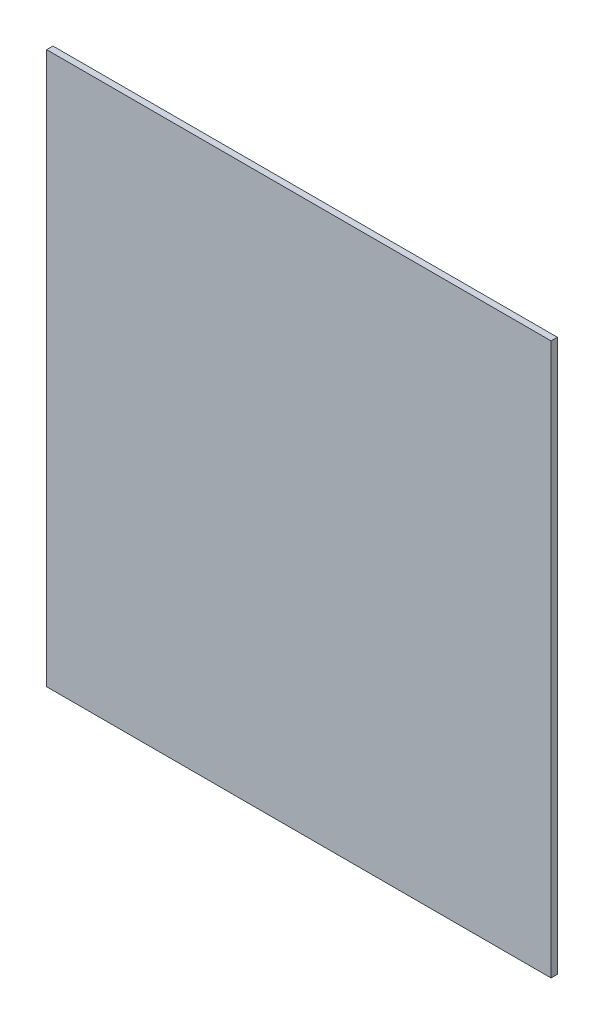
ISO-10303-21;
HEADER;
FILE_DESCRIPTION(('STEP AP214'),'2;1');
FILE_NAME('part.step','',(''),(''),'','','');
FILE_SCHEMA(('AUTOMOTIVE_DESIGN { 1 0 10303 214 1 1 1 1 }'));
ENDSEC;
DATA;
#1=APPLICATION_CONTEXT('core data for automotive mechanical design processes');
#2=APPLICATION_PROTOCOL_DEFINITION('international standard','automotive_design',2000,#1);
#3=PRODUCT_CONTEXT('',#1,'mechanical');
#4=PRODUCT('Part','Part','',(#3));
#5=PRODUCT_RELATED_PRODUCT_CATEGORY('part','',(#4));
#6=PRODUCT_DEFINITION_FORMATION('','',#4);
#7=PRODUCT_DEFINITION_CONTEXT('part definition',#1,'design');
#8=PRODUCT_DEFINITION('design','',#6,#7);
#9=PRODUCT_DEFINITION_SHAPE('','',#8);
#10=(LENGTH_UNIT() NAMED_UNIT(*) SI_UNIT(.MILLI.,.METRE.));
#11=(NAMED_UNIT(*) PLANE_ANGLE_UNIT() SI_UNIT($,.RADIAN.));
#12=(NAMED_UNIT(*) SI_UNIT($,.STERADIAN.) SOLID_ANGLE_UNIT());
#13=UNCERTAINTY_MEASURE_WITH_UNIT(LENGTH_MEASURE(1.E-05),#10,'distance_accuracy_value','');
#14=(GEOMETRIC_REPRESENTATION_CONTEXT(3) GLOBAL_UNCERTAINTY_ASSIGNED_CONTEXT((#13)) GLOBAL_UNIT_ASSIGNED_CONTEXT((#10,
#11,#12)) REPRESENTATION_CONTEXT('',''));
#15=CARTESIAN_POINT('',(0.,0.,0.));
#16=DIRECTION('',(0.,0.,1.));
#17=DIRECTION('',(1.,0.,0.));
#18=AXIS2_PLACEMENT_3D('',#15,#16,#17);
#19=CARTESIAN_POINT('',(-52.2088082243586,16.5000000000001,0.8));
#20=DIRECTION('',(1.,0.,0.));
#21=DIRECTION('',(0.,1.,0.));
#22=AXIS2_PLACEMENT_3D('',#19,#20,#21);
#23=PLANE('',#22);
#24=DIRECTION('',(0.,-1.,0.));
#25=VECTOR('',#24,1.);
#26=CARTESIAN_POINT('',(-52.2088082243586,16.5000000000001,0.));
#27=LINE('',#26,#25);
#28=CARTESIAN_POINT('',(-52.2088082243586,16.5000000000001,0.));
#29=VERTEX_POINT('',#28);
#30=CARTESIAN_POINT('',(-52.2088082243586,-53.4999999999999,0.));
#31=VERTEX_POINT('',#30);
#32=EDGE_CURVE('E96',#29,#31,#27,.T.);
#33=ORIENTED_EDGE('',*,*,#32,.T.);
#34=DIRECTION('',(0.,0.,-1.));
#35=VECTOR('',#34,1.);
#36=CARTESIAN_POINT('',(-52.2088082243586,-53.4999999999999,0.8));
#37=LINE('',#36,#35);
#38=CARTESIAN_POINT('',(-52.2088082243586,-53.4999999999999,0.8));
#39=VERTEX_POINT('',#38);
#40=EDGE_CURVE('E11',#39,#31,#37,.T.);
#41=ORIENTED_EDGE('',*,*,#40,.F.);
#42=DIRECTION('',(0.,-1.,0.));
#43=VECTOR('',#42,1.);
#44=CARTESIAN_POINT('',(-52.2088082243586,16.5000000000001,0.8));
#45=LINE('',#44,#43);
#46=CARTESIAN_POINT('',(-52.2088082243586,16.5000000000001,0.8));
#47=VERTEX_POINT('',#46);
#48=EDGE_CURVE('E84',#47,#39,#45,.T.);
#49=ORIENTED_EDGE('',*,*,#48,.F.);
#50=DIRECTION('',(0.,0.,-1.));
#51=VECTOR('',#50,1.);
#52=CARTESIAN_POINT('',(-52.2088082243586,16.5000000000001,0.8));
#53=LINE('',#52,#51);
#54=EDGE_CURVE('E92',#47,#29,#53,.T.);
#55=ORIENTED_EDGE('',*,*,#54,.T.);
#56=EDGE_LOOP('',(#33,#41,#49,#55));
#57=FACE_BOUND('',#56,.T.);
#58=ADVANCED_FACE('F33',(#57),#23,.F.);
#59=CARTESIAN_POINT('',(-52.2088082243586,-53.4999999999999,0.8));
#60=DIRECTION('',(0.,1.,0.));
#61=DIRECTION('',(0.,0.,1.));
#62=AXIS2_PLACEMENT_3D('',#59,#60,#61);
#63=PLANE('',#62);
#64=DIRECTION('',(1.,0.,0.));
#65=VECTOR('',#64,1.);
#66=CARTESIAN_POINT('',(-52.2088082243586,-53.4999999999999,0.));
#67=LINE('',#66,#65);
#68=CARTESIAN_POINT('',(11.7911917756414,-53.4999999999999,0.));
#69=VERTEX_POINT('',#68);
#70=EDGE_CURVE('E88',#31,#69,#67,.T.);
#71=ORIENTED_EDGE('',*,*,#70,.T.);
#72=DIRECTION('',(0.,0.,-1.));
#73=VECTOR('',#72,1.);
#74=CARTESIAN_POINT('',(11.7911917756414,-53.4999999999999,0.8));
#75=LINE('',#74,#73);
#76=CARTESIAN_POINT('',(11.7911917756414,-53.4999999999999,0.8));
#77=VERTEX_POINT('',#76);
#78=EDGE_CURVE('E41',#77,#69,#75,.T.);
#79=ORIENTED_EDGE('',*,*,#78,.F.);
#80=DIRECTION('',(1.,0.,0.));
#81=VECTOR('',#80,1.);
#82=CARTESIAN_POINT('',(-52.2088082243586,-53.4999999999999,0.8));
#83=LINE('',#82,#81);
#84=EDGE_CURVE('E79',#39,#77,#83,.T.);
#85=ORIENTED_EDGE('',*,*,#84,.F.);
#86=ORIENTED_EDGE('',*,*,#40,.T.);
#87=EDGE_LOOP('',(#71,#79,#85,#86));
#88=FACE_BOUND('',#87,.T.);
#89=ADVANCED_FACE('F87',(#88),#63,.F.);
#90=CARTESIAN_POINT('',(11.7911917756414,16.5000000000001,0.8));
#91=DIRECTION('',(-1.,0.,0.));
#92=DIRECTION('',(0.,-1.,0.));
#93=AXIS2_PLACEMENT_3D('',#90,#91,#92);
#94=PLANE('',#93);
#95=DIRECTION('',(0.,1.,0.));
#96=VECTOR('',#95,1.);
#97=CARTESIAN_POINT('',(11.7911917756414,16.5000000000001,0.));
#98=LINE('',#97,#96);
#99=CARTESIAN_POINT('',(11.7911917756414,16.5000000000001,0.));
#100=VERTEX_POINT('',#99);
#101=EDGE_CURVE('E66',#69,#100,#98,.T.);
#102=ORIENTED_EDGE('',*,*,#101,.T.);
#103=DIRECTION('',(0.,0.,-1.));
#104=VECTOR('',#103,1.);
#105=CARTESIAN_POINT('',(11.7911917756414,16.5000000000001,0.8));
#106=LINE('',#105,#104);
#107=CARTESIAN_POINT('',(11.7911917756414,16.5000000000001,0.8));
#108=VERTEX_POINT('',#107);
#109=EDGE_CURVE('E89',#108,#100,#106,.T.);
#110=ORIENTED_EDGE('',*,*,#109,.F.);
#111=DIRECTION('',(0.,1.,0.));
#112=VECTOR('',#111,1.);
#113=CARTESIAN_POINT('',(11.7911917756414,16.5000000000001,0.8));
#114=LINE('',#113,#112);
#115=EDGE_CURVE('E82',#77,#108,#114,.T.);
#116=ORIENTED_EDGE('',*,*,#115,.F.);
#117=ORIENTED_EDGE('',*,*,#78,.T.);
#118=EDGE_LOOP('',(#102,#110,#116,#117));
#119=FACE_BOUND('',#118,.T.);
#120=ADVANCED_FACE('F90',(#119),#94,.F.);
#121=CARTESIAN_POINT('',(-52.2088082243586,16.5000000000001,0.8));
#122=DIRECTION('',(0.,-1.,0.));
#123=DIRECTION('',(0.,0.,-1.));
#124=AXIS2_PLACEMENT_3D('',#121,#122,#123);
#125=PLANE('',#124);
#126=DIRECTION('',(-1.,0.,0.));
#127=VECTOR('',#126,1.);
#128=CARTESIAN_POINT('',(-52.2088082243586,16.5000000000001,0.));
#129=LINE('',#128,#127);
#130=EDGE_CURVE('E72',#100,#29,#129,.T.);
#131=ORIENTED_EDGE('',*,*,#130,.T.);
#132=ORIENTED_EDGE('',*,*,#54,.F.);
#133=DIRECTION('',(-1.,0.,0.));
#134=VECTOR('',#133,1.);
#135=CARTESIAN_POINT('',(-52.2088082243586,16.5000000000001,0.8));
#136=LINE('',#135,#134);
#137=EDGE_CURVE('E49',#108,#47,#136,.T.);
#138=ORIENTED_EDGE('',*,*,#137,.F.);
#139=ORIENTED_EDGE('',*,*,#109,.T.);
#140=EDGE_LOOP('',(#131,#132,#138,#139));
#141=FACE_BOUND('',#140,.T.);
#142=ADVANCED_FACE('F103',(#141),#125,.F.);
#143=CARTESIAN_POINT('',(0.,0.,0.8));
#144=DIRECTION('',(0.,0.,1.));
#145=DIRECTION('',(1.,0.,0.));
#146=AXIS2_PLACEMENT_3D('',#143,#144,#145);
#147=PLANE('',#146);
#148=ORIENTED_EDGE('',*,*,#48,.T.);
#149=ORIENTED_EDGE('',*,*,#84,.T.);
#150=ORIENTED_EDGE('',*,*,#115,.T.);
#151=ORIENTED_EDGE('',*,*,#137,.T.);
#152=EDGE_LOOP('',(#148,#149,#150,#151));
#153=FACE_BOUND('',#152,.T.);
#154=ADVANCED_FACE('F80',(#153),#147,.T.);
#155=CARTESIAN_POINT('',(0.,0.,0.));
#156=DIRECTION('',(0.,0.,1.));
#157=DIRECTION('',(1.,0.,0.));
#158=AXIS2_PLACEMENT_3D('',#155,#156,#157);
#159=PLANE('',#158);
#160=ORIENTED_EDGE('',*,*,#32,.F.);
#161=ORIENTED_EDGE('',*,*,#130,.F.);
#162=ORIENTED_EDGE('',*,*,#101,.F.);
#163=ORIENTED_EDGE('',*,*,#70,.F.);
#164=EDGE_LOOP('',(#160,#161,#162,#163));
#165=FACE_BOUND('',#164,.T.);
#166=ADVANCED_FACE('F106',(#165),#159,.F.);
#167=CLOSED_SHELL('',(#58,#89,#120,#142,#154,#166));
#168=MANIFOLD_SOLID_BREP('B2',#167);
#169=ADVANCED_BREP_SHAPE_REPRESENTATION('',(#18,#168),#14);
#170=SHAPE_DEFINITION_REPRESENTATION(#9,#169);
ENDSEC;
END-ISO-10303-21;
